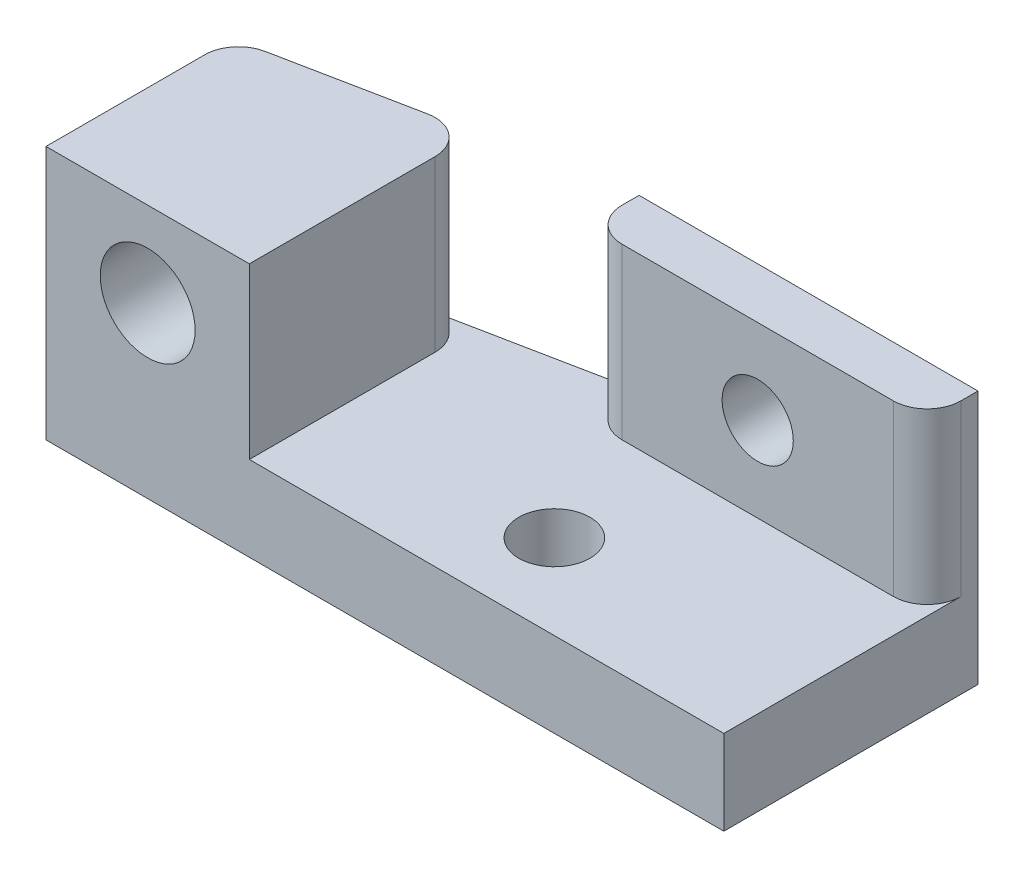
ISO-10303-21;
HEADER;
FILE_DESCRIPTION(('STEP AP214'),'2;1');
FILE_NAME('part.step','',(''),(''),'','','');
FILE_SCHEMA(('AUTOMOTIVE_DESIGN { 1 0 10303 214 1 1 1 1 }'));
ENDSEC;
DATA;
#1=APPLICATION_CONTEXT('core data for automotive mechanical design processes');
#2=APPLICATION_PROTOCOL_DEFINITION('international standard','automotive_design',2000,#1);
#3=PRODUCT_CONTEXT('',#1,'mechanical');
#4=PRODUCT('Part','Part','',(#3));
#5=PRODUCT_RELATED_PRODUCT_CATEGORY('part','',(#4));
#6=PRODUCT_DEFINITION_FORMATION('','',#4);
#7=PRODUCT_DEFINITION_CONTEXT('part definition',#1,'design');
#8=PRODUCT_DEFINITION('design','',#6,#7);
#9=PRODUCT_DEFINITION_SHAPE('','',#8);
#10=(LENGTH_UNIT() NAMED_UNIT(*) SI_UNIT(.MILLI.,.METRE.));
#11=(NAMED_UNIT(*) PLANE_ANGLE_UNIT() SI_UNIT($,.RADIAN.));
#12=(NAMED_UNIT(*) SI_UNIT($,.STERADIAN.) SOLID_ANGLE_UNIT());
#13=UNCERTAINTY_MEASURE_WITH_UNIT(LENGTH_MEASURE(1.E-05),#10,'distance_accuracy_value','');
#14=(GEOMETRIC_REPRESENTATION_CONTEXT(3) GLOBAL_UNCERTAINTY_ASSIGNED_CONTEXT((#13)) GLOBAL_UNIT_ASSIGNED_CONTEXT((#10,
#11,#12)) REPRESENTATION_CONTEXT('',''));
#15=CARTESIAN_POINT('',(0.,0.,0.));
#16=DIRECTION('',(0.,0.,1.));
#17=DIRECTION('',(1.,0.,0.));
#18=AXIS2_PLACEMENT_3D('',#15,#16,#17);
#19=CARTESIAN_POINT('',(0.,5.,0.));
#20=DIRECTION('',(0.,-1.,0.));
#21=DIRECTION('',(0.,0.,-1.));
#22=AXIS2_PLACEMENT_3D('',#19,#20,#21);
#23=PLANE('',#22);
#24=CARTESIAN_POINT('',(5.,5.,10.));
#25=DIRECTION('',(0.,1.,0.));
#26=DIRECTION('',(0.,0.,1.));
#27=AXIS2_PLACEMENT_3D('',#24,#25,#26);
#28=CIRCLE('',#27,2.1);
#29=CARTESIAN_POINT('',(5.,5.,12.1));
#30=VERTEX_POINT('',#29);
#31=EDGE_CURVE('E187',#30,#30,#28,.T.);
#32=ORIENTED_EDGE('',*,*,#31,.F.);
#33=EDGE_LOOP('',(#32));
#34=FACE_BOUND('',#33,.T.);
#35=DIRECTION('',(-0.98058067569092,0.,0.196116135138184));
#36=VECTOR('',#35,1.);
#37=CARTESIAN_POINT('',(-20.,5.,4.00000000000001));
#38=LINE('',#37,#36);
#39=CARTESIAN_POINT('',(0.,5.,0.));
#40=VERTEX_POINT('',#39);
#41=CARTESIAN_POINT('',(-10.3922322702764,5.,2.07844645405528));
#42=VERTEX_POINT('',#41);
#43=EDGE_CURVE('E193',#40,#42,#38,.T.);
#44=ORIENTED_EDGE('',*,*,#43,.T.);
#45=CARTESIAN_POINT('',(-9.99999999999999,5.,4.03960780543712));
#46=DIRECTION('',(0.,-1.,0.));
#47=DIRECTION('',(0.,0.,-1.));
#48=AXIS2_PLACEMENT_3D('',#45,#46,#47);
#49=CIRCLE('',#48,2.);
#50=CARTESIAN_POINT('',(-7.99999999999999,5.,4.03960780543712));
#51=VERTEX_POINT('',#50);
#52=EDGE_CURVE('E242',#42,#51,#49,.T.);
#53=ORIENTED_EDGE('',*,*,#52,.T.);
#54=DIRECTION('',(0.,0.,1.));
#55=VECTOR('',#54,1.);
#56=CARTESIAN_POINT('',(-7.99999999999999,5.,0.));
#57=LINE('',#56,#55);
#58=CARTESIAN_POINT('',(-7.99999999999999,5.,15.));
#59=VERTEX_POINT('',#58);
#60=EDGE_CURVE('E165',#51,#59,#57,.T.);
#61=ORIENTED_EDGE('',*,*,#60,.T.);
#62=DIRECTION('',(1.,0.,0.));
#63=VECTOR('',#62,1.);
#64=CARTESIAN_POINT('',(20.,5.,15.));
#65=LINE('',#64,#63);
#66=CARTESIAN_POINT('',(20.,5.,15.));
#67=VERTEX_POINT('',#66);
#68=EDGE_CURVE('E195',#59,#67,#65,.T.);
#69=ORIENTED_EDGE('',*,*,#68,.T.);
#70=DIRECTION('',(0.,0.,-1.));
#71=VECTOR('',#70,1.);
#72=CARTESIAN_POINT('',(20.,5.,0.));
#73=LINE('',#72,#71);
#74=CARTESIAN_POINT('',(20.,5.,1.));
#75=VERTEX_POINT('',#74);
#76=EDGE_CURVE('E198',#67,#75,#73,.T.);
#77=ORIENTED_EDGE('',*,*,#76,.T.);
#78=CARTESIAN_POINT('',(18.,5.,1.));
#79=DIRECTION('',(0.,-1.,0.));
#80=DIRECTION('',(0.,0.,-1.));
#81=AXIS2_PLACEMENT_3D('',#78,#79,#80);
#82=CIRCLE('',#81,2.);
#83=CARTESIAN_POINT('',(18.,5.,3.));
#84=VERTEX_POINT('',#83);
#85=EDGE_CURVE('E44',#75,#84,#82,.T.);
#86=ORIENTED_EDGE('',*,*,#85,.T.);
#87=DIRECTION('',(1.,0.,0.));
#88=VECTOR('',#87,1.);
#89=CARTESIAN_POINT('',(0.,5.,3.));
#90=LINE('',#89,#88);
#91=CARTESIAN_POINT('',(2.,5.,3.));
#92=VERTEX_POINT('',#91);
#93=EDGE_CURVE('E173',#92,#84,#90,.T.);
#94=ORIENTED_EDGE('',*,*,#93,.F.);
#95=CARTESIAN_POINT('',(2.,5.,1.));
#96=DIRECTION('',(0.,-1.,0.));
#97=DIRECTION('',(0.,0.,-1.));
#98=AXIS2_PLACEMENT_3D('',#95,#96,#97);
#99=CIRCLE('',#98,2.);
#100=CARTESIAN_POINT('',(0.,5.,1.));
#101=VERTEX_POINT('',#100);
#102=EDGE_CURVE('E11',#92,#101,#99,.T.);
#103=ORIENTED_EDGE('',*,*,#102,.T.);
#104=DIRECTION('',(0.,0.,1.));
#105=VECTOR('',#104,1.);
#106=CARTESIAN_POINT('',(0.,5.,0.));
#107=LINE('',#106,#105);
#108=EDGE_CURVE('E161',#40,#101,#107,.T.);
#109=ORIENTED_EDGE('',*,*,#108,.F.);
#110=EDGE_LOOP('',(#44,#53,#61,#69,#77,#86,#94,#103,#109));
#111=FACE_BOUND('',#110,.T.);
#112=ADVANCED_FACE('F36',(#34,#111),#23,.F.);
#113=CARTESIAN_POINT('',(0.,0.,0.));
#114=DIRECTION('',(0.,-1.,0.));
#115=DIRECTION('',(0.,0.,-1.));
#116=AXIS2_PLACEMENT_3D('',#113,#114,#115);
#117=PLANE('',#116);
#118=DIRECTION('',(0.,0.,1.));
#119=VECTOR('',#118,1.);
#120=CARTESIAN_POINT('',(-20.,0.,15.));
#121=LINE('',#120,#119);
#122=CARTESIAN_POINT('',(-20.,0.,5.63960780543712));
#123=VERTEX_POINT('',#122);
#124=CARTESIAN_POINT('',(-20.,0.,15.));
#125=VERTEX_POINT('',#124);
#126=EDGE_CURVE('E150',#123,#125,#121,.T.);
#127=ORIENTED_EDGE('',*,*,#126,.F.);
#128=CARTESIAN_POINT('',(-18.,0.,5.63960780543712));
#129=DIRECTION('',(0.,-1.,0.));
#130=DIRECTION('',(0.,0.,-1.));
#131=AXIS2_PLACEMENT_3D('',#128,#129,#130);
#132=CIRCLE('',#131,2.);
#133=CARTESIAN_POINT('',(-18.3922322702764,0.,3.67844645405528));
#134=VERTEX_POINT('',#133);
#135=EDGE_CURVE('E51',#123,#134,#132,.T.);
#136=ORIENTED_EDGE('',*,*,#135,.T.);
#137=DIRECTION('',(-0.98058067569092,0.,0.196116135138184));
#138=VECTOR('',#137,1.);
#139=CARTESIAN_POINT('',(-20.,0.,4.00000000000001));
#140=LINE('',#139,#138);
#141=CARTESIAN_POINT('',(0.,0.,0.));
#142=VERTEX_POINT('',#141);
#143=EDGE_CURVE('E190',#142,#134,#140,.T.);
#144=ORIENTED_EDGE('',*,*,#143,.F.);
#145=DIRECTION('',(-1.,0.,0.));
#146=VECTOR('',#145,1.);
#147=CARTESIAN_POINT('',(0.,0.,0.));
#148=LINE('',#147,#146);
#149=CARTESIAN_POINT('',(20.,0.,0.));
#150=VERTEX_POINT('',#149);
#151=EDGE_CURVE('E196',#150,#142,#148,.T.);
#152=ORIENTED_EDGE('',*,*,#151,.F.);
#153=DIRECTION('',(0.,0.,-1.));
#154=VECTOR('',#153,1.);
#155=CARTESIAN_POINT('',(20.,0.,0.));
#156=LINE('',#155,#154);
#157=CARTESIAN_POINT('',(20.,0.,15.));
#158=VERTEX_POINT('',#157);
#159=EDGE_CURVE('E206',#158,#150,#156,.T.);
#160=ORIENTED_EDGE('',*,*,#159,.F.);
#161=DIRECTION('',(1.,0.,0.));
#162=VECTOR('',#161,1.);
#163=CARTESIAN_POINT('',(20.,0.,15.));
#164=LINE('',#163,#162);
#165=EDGE_CURVE('E204',#125,#158,#164,.T.);
#166=ORIENTED_EDGE('',*,*,#165,.F.);
#167=EDGE_LOOP('',(#127,#136,#144,#152,#160,#166));
#168=FACE_BOUND('',#167,.T.);
#169=CARTESIAN_POINT('',(5.,0.,10.));
#170=DIRECTION('',(0.,1.,0.));
#171=DIRECTION('',(0.,0.,1.));
#172=AXIS2_PLACEMENT_3D('',#169,#170,#171);
#173=CIRCLE('',#172,2.1);
#174=CARTESIAN_POINT('',(5.,0.,12.1));
#175=VERTEX_POINT('',#174);
#176=EDGE_CURVE('E186',#175,#175,#173,.T.);
#177=ORIENTED_EDGE('',*,*,#176,.T.);
#178=EDGE_LOOP('',(#177));
#179=FACE_BOUND('',#178,.T.);
#180=ADVANCED_FACE('F315',(#168,#179),#117,.T.);
#181=CARTESIAN_POINT('',(-20.,5.,4.00000000000001));
#182=DIRECTION('',(0.196116135138184,0.,0.98058067569092));
#183=DIRECTION('',(0.98058067569092,0.,-0.196116135138185));
#184=AXIS2_PLACEMENT_3D('',#181,#182,#183);
#185=PLANE('',#184);
#186=DIRECTION('',(-0.98058067569092,0.,0.196116135138184));
#187=VECTOR('',#186,1.);
#188=CARTESIAN_POINT('',(0.,15.,0.));
#189=LINE('',#188,#187);
#190=CARTESIAN_POINT('',(-10.3922322702764,15.,2.07844645405528));
#191=VERTEX_POINT('',#190);
#192=CARTESIAN_POINT('',(-18.3922322702764,15.,3.67844645405528));
#193=VERTEX_POINT('',#192);
#194=EDGE_CURVE('E144',#191,#193,#189,.T.);
#195=ORIENTED_EDGE('',*,*,#194,.F.);
#196=DIRECTION('',(0.,-1.,0.));
#197=VECTOR('',#196,1.);
#198=CARTESIAN_POINT('',(-10.3922322702764,5.,2.07844645405528));
#199=LINE('',#198,#197);
#200=EDGE_CURVE('E217',#191,#42,#199,.T.);
#201=ORIENTED_EDGE('',*,*,#200,.T.);
#202=ORIENTED_EDGE('',*,*,#43,.F.);
#203=DIRECTION('',(0.,-1.,0.));
#204=VECTOR('',#203,1.);
#205=CARTESIAN_POINT('',(0.,5.,0.));
#206=LINE('',#205,#204);
#207=EDGE_CURVE('E200',#40,#142,#206,.T.);
#208=ORIENTED_EDGE('',*,*,#207,.T.);
#209=ORIENTED_EDGE('',*,*,#143,.T.);
#210=DIRECTION('',(0.,-1.,0.));
#211=VECTOR('',#210,1.);
#212=CARTESIAN_POINT('',(-18.3922322702764,5.,3.67844645405528));
#213=LINE('',#212,#211);
#214=EDGE_CURVE('E153',#134,#193,#213,.F.);
#215=ORIENTED_EDGE('',*,*,#214,.T.);
#216=EDGE_LOOP('',(#195,#201,#202,#208,#209,#215));
#217=FACE_BOUND('',#216,.T.);
#218=ADVANCED_FACE('F279',(#217),#185,.F.);
#219=CARTESIAN_POINT('',(-20.,5.,15.));
#220=DIRECTION('',(1.,0.,0.));
#221=DIRECTION('',(0.,0.,-1.));
#222=AXIS2_PLACEMENT_3D('',#219,#220,#221);
#223=PLANE('',#222);
#224=DIRECTION('',(0.,0.,1.));
#225=VECTOR('',#224,1.);
#226=CARTESIAN_POINT('',(-20.,15.,0.));
#227=LINE('',#226,#225);
#228=CARTESIAN_POINT('',(-20.,15.,5.63960780543712));
#229=VERTEX_POINT('',#228);
#230=CARTESIAN_POINT('',(-20.,15.,15.));
#231=VERTEX_POINT('',#230);
#232=EDGE_CURVE('E133',#229,#231,#227,.T.);
#233=ORIENTED_EDGE('',*,*,#232,.F.);
#234=DIRECTION('',(0.,-1.,0.));
#235=VECTOR('',#234,1.);
#236=CARTESIAN_POINT('',(-20.,5.,5.63960780543712));
#237=LINE('',#236,#235);
#238=EDGE_CURVE('E239',#229,#123,#237,.T.);
#239=ORIENTED_EDGE('',*,*,#238,.T.);
#240=ORIENTED_EDGE('',*,*,#126,.T.);
#241=DIRECTION('',(0.,-1.,0.));
#242=VECTOR('',#241,1.);
#243=CARTESIAN_POINT('',(-20.,5.,15.));
#244=LINE('',#243,#242);
#245=EDGE_CURVE('E147',#231,#125,#244,.T.);
#246=ORIENTED_EDGE('',*,*,#245,.F.);
#247=EDGE_LOOP('',(#233,#239,#240,#246));
#248=FACE_BOUND('',#247,.T.);
#249=ADVANCED_FACE('F148',(#248),#223,.F.);
#250=CARTESIAN_POINT('',(20.,5.,15.));
#251=DIRECTION('',(0.,0.,-1.));
#252=DIRECTION('',(-1.,0.,0.));
#253=AXIS2_PLACEMENT_3D('',#250,#251,#252);
#254=PLANE('',#253);
#255=CARTESIAN_POINT('',(-14.,10.,15.));
#256=DIRECTION('',(0.,0.,1.));
#257=DIRECTION('',(1.,0.,0.));
#258=AXIS2_PLACEMENT_3D('',#255,#256,#257);
#259=CIRCLE('',#258,2.8);
#260=CARTESIAN_POINT('',(-11.2,10.,15.));
#261=VERTEX_POINT('',#260);
#262=EDGE_CURVE('E290',#261,#261,#259,.T.);
#263=ORIENTED_EDGE('',*,*,#262,.F.);
#264=EDGE_LOOP('',(#263));
#265=FACE_BOUND('',#264,.T.);
#266=ORIENTED_EDGE('',*,*,#165,.T.);
#267=DIRECTION('',(0.,-1.,0.));
#268=VECTOR('',#267,1.);
#269=CARTESIAN_POINT('',(20.,5.,15.));
#270=LINE('',#269,#268);
#271=EDGE_CURVE('E154',#67,#158,#270,.T.);
#272=ORIENTED_EDGE('',*,*,#271,.F.);
#273=ORIENTED_EDGE('',*,*,#68,.F.);
#274=DIRECTION('',(0.,-1.,0.));
#275=VECTOR('',#274,1.);
#276=CARTESIAN_POINT('',(-7.99999999999999,15.,15.));
#277=LINE('',#276,#275);
#278=CARTESIAN_POINT('',(-7.99999999999999,15.,15.));
#279=VERTEX_POINT('',#278);
#280=EDGE_CURVE('E159',#279,#59,#277,.T.);
#281=ORIENTED_EDGE('',*,*,#280,.F.);
#282=DIRECTION('',(1.,0.,0.));
#283=VECTOR('',#282,1.);
#284=CARTESIAN_POINT('',(0.,15.,15.));
#285=LINE('',#284,#283);
#286=EDGE_CURVE('E138',#231,#279,#285,.T.);
#287=ORIENTED_EDGE('',*,*,#286,.F.);
#288=ORIENTED_EDGE('',*,*,#245,.T.);
#289=EDGE_LOOP('',(#266,#272,#273,#281,#287,#288));
#290=FACE_BOUND('',#289,.T.);
#291=ADVANCED_FACE('F156',(#265,#290),#254,.F.);
#292=CARTESIAN_POINT('',(20.,5.,0.));
#293=DIRECTION('',(-1.,0.,0.));
#294=DIRECTION('',(0.,0.,1.));
#295=AXIS2_PLACEMENT_3D('',#292,#293,#294);
#296=PLANE('',#295);
#297=DIRECTION('',(0.,0.,-1.));
#298=VECTOR('',#297,1.);
#299=CARTESIAN_POINT('',(20.,15.,0.));
#300=LINE('',#299,#298);
#301=CARTESIAN_POINT('',(20.,15.,1.));
#302=VERTEX_POINT('',#301);
#303=CARTESIAN_POINT('',(20.,15.,0.));
#304=VERTEX_POINT('',#303);
#305=EDGE_CURVE('E176',#302,#304,#300,.T.);
#306=ORIENTED_EDGE('',*,*,#305,.F.);
#307=DIRECTION('',(0.,-1.,0.));
#308=VECTOR('',#307,1.);
#309=CARTESIAN_POINT('',(20.,5.,1.));
#310=LINE('',#309,#308);
#311=EDGE_CURVE('E225',#302,#75,#310,.T.);
#312=ORIENTED_EDGE('',*,*,#311,.T.);
#313=ORIENTED_EDGE('',*,*,#76,.F.);
#314=ORIENTED_EDGE('',*,*,#271,.T.);
#315=ORIENTED_EDGE('',*,*,#159,.T.);
#316=DIRECTION('',(0.,-1.,0.));
#317=VECTOR('',#316,1.);
#318=CARTESIAN_POINT('',(20.,5.,0.));
#319=LINE('',#318,#317);
#320=EDGE_CURVE('E211',#304,#150,#319,.T.);
#321=ORIENTED_EDGE('',*,*,#320,.F.);
#322=EDGE_LOOP('',(#306,#312,#313,#314,#315,#321));
#323=FACE_BOUND('',#322,.T.);
#324=ADVANCED_FACE('F259',(#323),#296,.F.);
#325=CARTESIAN_POINT('',(0.,5.,0.));
#326=DIRECTION('',(0.,0.,1.));
#327=DIRECTION('',(1.,0.,0.));
#328=AXIS2_PLACEMENT_3D('',#325,#326,#327);
#329=PLANE('',#328);
#330=CARTESIAN_POINT('',(10.,10.,0.));
#331=DIRECTION('',(0.,0.,1.));
#332=DIRECTION('',(1.,0.,0.));
#333=AXIS2_PLACEMENT_3D('',#330,#331,#332);
#334=CIRCLE('',#333,2.1);
#335=CARTESIAN_POINT('',(12.1,10.,0.));
#336=VERTEX_POINT('',#335);
#337=EDGE_CURVE('E293',#336,#336,#334,.T.);
#338=ORIENTED_EDGE('',*,*,#337,.T.);
#339=EDGE_LOOP('',(#338));
#340=FACE_BOUND('',#339,.T.);
#341=ORIENTED_EDGE('',*,*,#151,.T.);
#342=ORIENTED_EDGE('',*,*,#207,.F.);
#343=DIRECTION('',(0.,-1.,0.));
#344=VECTOR('',#343,1.);
#345=CARTESIAN_POINT('',(0.,15.,0.));
#346=LINE('',#345,#344);
#347=CARTESIAN_POINT('',(0.,15.,0.));
#348=VERTEX_POINT('',#347);
#349=EDGE_CURVE('E180',#348,#40,#346,.T.);
#350=ORIENTED_EDGE('',*,*,#349,.F.);
#351=DIRECTION('',(-1.,0.,0.));
#352=VECTOR('',#351,1.);
#353=CARTESIAN_POINT('',(0.,15.,0.));
#354=LINE('',#353,#352);
#355=EDGE_CURVE('E178',#304,#348,#354,.T.);
#356=ORIENTED_EDGE('',*,*,#355,.F.);
#357=ORIENTED_EDGE('',*,*,#320,.T.);
#358=EDGE_LOOP('',(#341,#342,#350,#356,#357));
#359=FACE_BOUND('',#358,.T.);
#360=ADVANCED_FACE('F265',(#340,#359),#329,.F.);
#361=CARTESIAN_POINT('',(5.,5.,10.));
#362=DIRECTION('',(0.,-1.,0.));
#363=DIRECTION('',(0.,0.,-1.));
#364=AXIS2_PLACEMENT_3D('',#361,#362,#363);
#365=CYLINDRICAL_SURFACE('',#364,2.1);
#366=ORIENTED_EDGE('',*,*,#31,.T.);
#367=EDGE_LOOP('',(#366));
#368=FACE_BOUND('',#367,.T.);
#369=ORIENTED_EDGE('',*,*,#176,.F.);
#370=EDGE_LOOP('',(#369));
#371=FACE_BOUND('',#370,.T.);
#372=ADVANCED_FACE('F312',(#368,#371),#365,.F.);
#373=CARTESIAN_POINT('',(0.,15.,0.));
#374=DIRECTION('',(1.,0.,0.));
#375=DIRECTION('',(0.,0.,-1.));
#376=AXIS2_PLACEMENT_3D('',#373,#374,#375);
#377=PLANE('',#376);
#378=ORIENTED_EDGE('',*,*,#108,.T.);
#379=DIRECTION('',(0.,-1.,0.));
#380=VECTOR('',#379,1.);
#381=CARTESIAN_POINT('',(0.,15.,1.));
#382=LINE('',#381,#380);
#383=CARTESIAN_POINT('',(0.,15.,1.));
#384=VERTEX_POINT('',#383);
#385=EDGE_CURVE('E237',#101,#384,#382,.F.);
#386=ORIENTED_EDGE('',*,*,#385,.T.);
#387=DIRECTION('',(0.,0.,1.));
#388=VECTOR('',#387,1.);
#389=CARTESIAN_POINT('',(0.,15.,0.));
#390=LINE('',#389,#388);
#391=EDGE_CURVE('E169',#348,#384,#390,.T.);
#392=ORIENTED_EDGE('',*,*,#391,.F.);
#393=ORIENTED_EDGE('',*,*,#349,.T.);
#394=EDGE_LOOP('',(#378,#386,#392,#393));
#395=FACE_BOUND('',#394,.T.);
#396=ADVANCED_FACE('F273',(#395),#377,.F.);
#397=CARTESIAN_POINT('',(0.,15.,3.));
#398=DIRECTION('',(0.,0.,-1.));
#399=DIRECTION('',(-1.,0.,0.));
#400=AXIS2_PLACEMENT_3D('',#397,#398,#399);
#401=PLANE('',#400);
#402=CARTESIAN_POINT('',(10.,10.,3.));
#403=DIRECTION('',(0.,0.,1.));
#404=DIRECTION('',(1.,0.,0.));
#405=AXIS2_PLACEMENT_3D('',#402,#403,#404);
#406=CIRCLE('',#405,2.1);
#407=CARTESIAN_POINT('',(12.1,10.,3.));
#408=VERTEX_POINT('',#407);
#409=EDGE_CURVE('E298',#408,#408,#406,.T.);
#410=ORIENTED_EDGE('',*,*,#409,.F.);
#411=EDGE_LOOP('',(#410));
#412=FACE_BOUND('',#411,.T.);
#413=ORIENTED_EDGE('',*,*,#93,.T.);
#414=DIRECTION('',(0.,-1.,0.));
#415=VECTOR('',#414,1.);
#416=CARTESIAN_POINT('',(18.,15.,3.));
#417=LINE('',#416,#415);
#418=CARTESIAN_POINT('',(18.,15.,3.));
#419=VERTEX_POINT('',#418);
#420=EDGE_CURVE('E231',#84,#419,#417,.F.);
#421=ORIENTED_EDGE('',*,*,#420,.T.);
#422=DIRECTION('',(1.,0.,0.));
#423=VECTOR('',#422,1.);
#424=CARTESIAN_POINT('',(0.,15.,3.));
#425=LINE('',#424,#423);
#426=CARTESIAN_POINT('',(2.,15.,3.));
#427=VERTEX_POINT('',#426);
#428=EDGE_CURVE('E172',#427,#419,#425,.T.);
#429=ORIENTED_EDGE('',*,*,#428,.F.);
#430=DIRECTION('',(0.,-1.,0.));
#431=VECTOR('',#430,1.);
#432=CARTESIAN_POINT('',(2.,15.,3.));
#433=LINE('',#432,#431);
#434=EDGE_CURVE('E228',#427,#92,#433,.T.);
#435=ORIENTED_EDGE('',*,*,#434,.T.);
#436=EDGE_LOOP('',(#413,#421,#429,#435));
#437=FACE_BOUND('',#436,.T.);
#438=ADVANCED_FACE('F249',(#412,#437),#401,.F.);
#439=CARTESIAN_POINT('',(0.,15.,0.));
#440=DIRECTION('',(0.,1.,0.));
#441=DIRECTION('',(0.,0.,1.));
#442=AXIS2_PLACEMENT_3D('',#439,#440,#441);
#443=PLANE('',#442);
#444=ORIENTED_EDGE('',*,*,#428,.T.);
#445=CARTESIAN_POINT('',(18.,15.,1.));
#446=DIRECTION('',(0.,1.,0.));
#447=DIRECTION('',(0.,0.,1.));
#448=AXIS2_PLACEMENT_3D('',#445,#446,#447);
#449=CIRCLE('',#448,2.);
#450=EDGE_CURVE('E235',#419,#302,#449,.T.);
#451=ORIENTED_EDGE('',*,*,#450,.T.);
#452=ORIENTED_EDGE('',*,*,#305,.T.);
#453=ORIENTED_EDGE('',*,*,#355,.T.);
#454=ORIENTED_EDGE('',*,*,#391,.T.);
#455=CARTESIAN_POINT('',(2.,15.,1.));
#456=DIRECTION('',(0.,1.,0.));
#457=DIRECTION('',(0.,0.,1.));
#458=AXIS2_PLACEMENT_3D('',#455,#456,#457);
#459=CIRCLE('',#458,2.);
#460=EDGE_CURVE('E233',#384,#427,#459,.T.);
#461=ORIENTED_EDGE('',*,*,#460,.T.);
#462=EDGE_LOOP('',(#444,#451,#452,#453,#454,#461));
#463=FACE_BOUND('',#462,.T.);
#464=ADVANCED_FACE('F256',(#463),#443,.T.);
#465=CARTESIAN_POINT('',(-7.99999999999999,15.,0.));
#466=DIRECTION('',(1.,0.,0.));
#467=DIRECTION('',(0.,0.,-1.));
#468=AXIS2_PLACEMENT_3D('',#465,#466,#467);
#469=PLANE('',#468);
#470=ORIENTED_EDGE('',*,*,#60,.F.);
#471=DIRECTION('',(0.,-1.,0.));
#472=VECTOR('',#471,1.);
#473=CARTESIAN_POINT('',(-7.99999999999999,15.,4.03960780543712));
#474=LINE('',#473,#472);
#475=CARTESIAN_POINT('',(-7.99999999999999,15.,4.03960780543712));
#476=VERTEX_POINT('',#475);
#477=EDGE_CURVE('E220',#51,#476,#474,.F.);
#478=ORIENTED_EDGE('',*,*,#477,.T.);
#479=DIRECTION('',(0.,0.,1.));
#480=VECTOR('',#479,1.);
#481=CARTESIAN_POINT('',(-7.99999999999999,15.,0.));
#482=LINE('',#481,#480);
#483=EDGE_CURVE('E166',#476,#279,#482,.T.);
#484=ORIENTED_EDGE('',*,*,#483,.T.);
#485=ORIENTED_EDGE('',*,*,#280,.T.);
#486=EDGE_LOOP('',(#470,#478,#484,#485));
#487=FACE_BOUND('',#486,.T.);
#488=ADVANCED_FACE('F287',(#487),#469,.T.);
#489=CARTESIAN_POINT('',(0.,15.,0.));
#490=DIRECTION('',(0.,1.,0.));
#491=DIRECTION('',(0.,0.,1.));
#492=AXIS2_PLACEMENT_3D('',#489,#490,#491);
#493=PLANE('',#492);
#494=ORIENTED_EDGE('',*,*,#483,.F.);
#495=CARTESIAN_POINT('',(-9.99999999999999,15.,4.03960780543712));
#496=DIRECTION('',(0.,1.,0.));
#497=DIRECTION('',(0.,0.,1.));
#498=AXIS2_PLACEMENT_3D('',#495,#496,#497);
#499=CIRCLE('',#498,2.);
#500=EDGE_CURVE('E223',#476,#191,#499,.T.);
#501=ORIENTED_EDGE('',*,*,#500,.T.);
#502=ORIENTED_EDGE('',*,*,#194,.T.);
#503=CARTESIAN_POINT('',(-18.,15.,5.63960780543712));
#504=DIRECTION('',(0.,1.,0.));
#505=DIRECTION('',(0.,0.,1.));
#506=AXIS2_PLACEMENT_3D('',#503,#504,#505);
#507=CIRCLE('',#506,2.);
#508=EDGE_CURVE('E142',#193,#229,#507,.T.);
#509=ORIENTED_EDGE('',*,*,#508,.T.);
#510=ORIENTED_EDGE('',*,*,#232,.T.);
#511=ORIENTED_EDGE('',*,*,#286,.T.);
#512=EDGE_LOOP('',(#494,#501,#502,#509,#510,#511));
#513=FACE_BOUND('',#512,.T.);
#514=ADVANCED_FACE('F136',(#513),#493,.T.);
#515=CARTESIAN_POINT('',(-14.,10.,5.9));
#516=DIRECTION('',(0.,0.,1.));
#517=DIRECTION('',(1.,0.,0.));
#518=AXIS2_PLACEMENT_3D('',#515,#516,#517);
#519=CYLINDRICAL_SURFACE('',#518,2.8);
#520=CARTESIAN_POINT('',(-14.,10.,5.9));
#521=DIRECTION('',(0.,0.,1.));
#522=DIRECTION('',(1.,0.,0.));
#523=AXIS2_PLACEMENT_3D('',#520,#521,#522);
#524=CIRCLE('',#523,2.8);
#525=CARTESIAN_POINT('',(-11.2,10.,5.9));
#526=VERTEX_POINT('',#525);
#527=EDGE_CURVE('E167',#526,#526,#524,.T.);
#528=ORIENTED_EDGE('',*,*,#527,.F.);
#529=EDGE_LOOP('',(#528));
#530=FACE_BOUND('',#529,.T.);
#531=ORIENTED_EDGE('',*,*,#262,.T.);
#532=EDGE_LOOP('',(#531));
#533=FACE_BOUND('',#532,.T.);
#534=ADVANCED_FACE('F396',(#530,#533),#519,.F.);
#535=CARTESIAN_POINT('',(-14.,10.,5.9));
#536=DIRECTION('',(0.,0.,1.));
#537=DIRECTION('',(1.,0.,0.));
#538=AXIS2_PLACEMENT_3D('',#535,#536,#537);
#539=PLANE('',#538);
#540=ORIENTED_EDGE('',*,*,#527,.T.);
#541=EDGE_LOOP('',(#540));
#542=FACE_BOUND('',#541,.T.);
#543=ADVANCED_FACE('F427',(#542),#539,.T.);
#544=CARTESIAN_POINT('',(10.,10.,-6.1));
#545=DIRECTION('',(0.,0.,1.));
#546=DIRECTION('',(1.,0.,0.));
#547=AXIS2_PLACEMENT_3D('',#544,#545,#546);
#548=CYLINDRICAL_SURFACE('',#547,2.1);
#549=ORIENTED_EDGE('',*,*,#409,.T.);
#550=EDGE_LOOP('',(#549));
#551=FACE_BOUND('',#550,.T.);
#552=ORIENTED_EDGE('',*,*,#337,.F.);
#553=EDGE_LOOP('',(#552));
#554=FACE_BOUND('',#553,.T.);
#555=ADVANCED_FACE('F302',(#551,#554),#548,.F.);
#556=CARTESIAN_POINT('',(-9.99999999999999,5.,4.03960780543712));
#557=DIRECTION('',(0.,1.,0.));
#558=DIRECTION('',(0.,0.,1.));
#559=AXIS2_PLACEMENT_3D('',#556,#557,#558);
#560=CYLINDRICAL_SURFACE('',#559,2.);
#561=ORIENTED_EDGE('',*,*,#500,.F.);
#562=ORIENTED_EDGE('',*,*,#477,.F.);
#563=ORIENTED_EDGE('',*,*,#52,.F.);
#564=ORIENTED_EDGE('',*,*,#200,.F.);
#565=EDGE_LOOP('',(#561,#562,#563,#564));
#566=FACE_BOUND('',#565,.T.);
#567=ADVANCED_FACE('F283',(#566),#560,.T.);
#568=CARTESIAN_POINT('',(18.,5.,1.));
#569=DIRECTION('',(0.,-1.,0.));
#570=DIRECTION('',(0.,0.,-1.));
#571=AXIS2_PLACEMENT_3D('',#568,#569,#570);
#572=CYLINDRICAL_SURFACE('',#571,2.);
#573=ORIENTED_EDGE('',*,*,#450,.F.);
#574=ORIENTED_EDGE('',*,*,#420,.F.);
#575=ORIENTED_EDGE('',*,*,#85,.F.);
#576=ORIENTED_EDGE('',*,*,#311,.F.);
#577=EDGE_LOOP('',(#573,#574,#575,#576));
#578=FACE_BOUND('',#577,.T.);
#579=ADVANCED_FACE('F253',(#578),#572,.T.);
#580=CARTESIAN_POINT('',(2.,15.,1.));
#581=DIRECTION('',(0.,-1.,0.));
#582=DIRECTION('',(0.,0.,-1.));
#583=AXIS2_PLACEMENT_3D('',#580,#581,#582);
#584=CYLINDRICAL_SURFACE('',#583,2.);
#585=ORIENTED_EDGE('',*,*,#460,.F.);
#586=ORIENTED_EDGE('',*,*,#385,.F.);
#587=ORIENTED_EDGE('',*,*,#102,.F.);
#588=ORIENTED_EDGE('',*,*,#434,.F.);
#589=EDGE_LOOP('',(#585,#586,#587,#588));
#590=FACE_BOUND('',#589,.T.);
#591=ADVANCED_FACE('F272',(#590),#584,.T.);
#592=CARTESIAN_POINT('',(-18.,5.,5.63960780543712));
#593=DIRECTION('',(0.,-1.,0.));
#594=DIRECTION('',(0.,0.,-1.));
#595=AXIS2_PLACEMENT_3D('',#592,#593,#594);
#596=CYLINDRICAL_SURFACE('',#595,2.);
#597=ORIENTED_EDGE('',*,*,#508,.F.);
#598=ORIENTED_EDGE('',*,*,#214,.F.);
#599=ORIENTED_EDGE('',*,*,#135,.F.);
#600=ORIENTED_EDGE('',*,*,#238,.F.);
#601=EDGE_LOOP('',(#597,#598,#599,#600));
#602=FACE_BOUND('',#601,.T.);
#603=ADVANCED_FACE('F38',(#602),#596,.T.);
#604=CLOSED_SHELL('',(#112,#180,#218,#249,#291,#324,#360,#372,#396,#438,#464,#488,#514,#534,
#543,#555,#567,#579,#591,#603));
#605=MANIFOLD_SOLID_BREP('B2',#604);
#606=ADVANCED_BREP_SHAPE_REPRESENTATION('',(#18,#605),#14);
#607=SHAPE_DEFINITION_REPRESENTATION(#9,#606);
ENDSEC;
END-ISO-10303-21;
